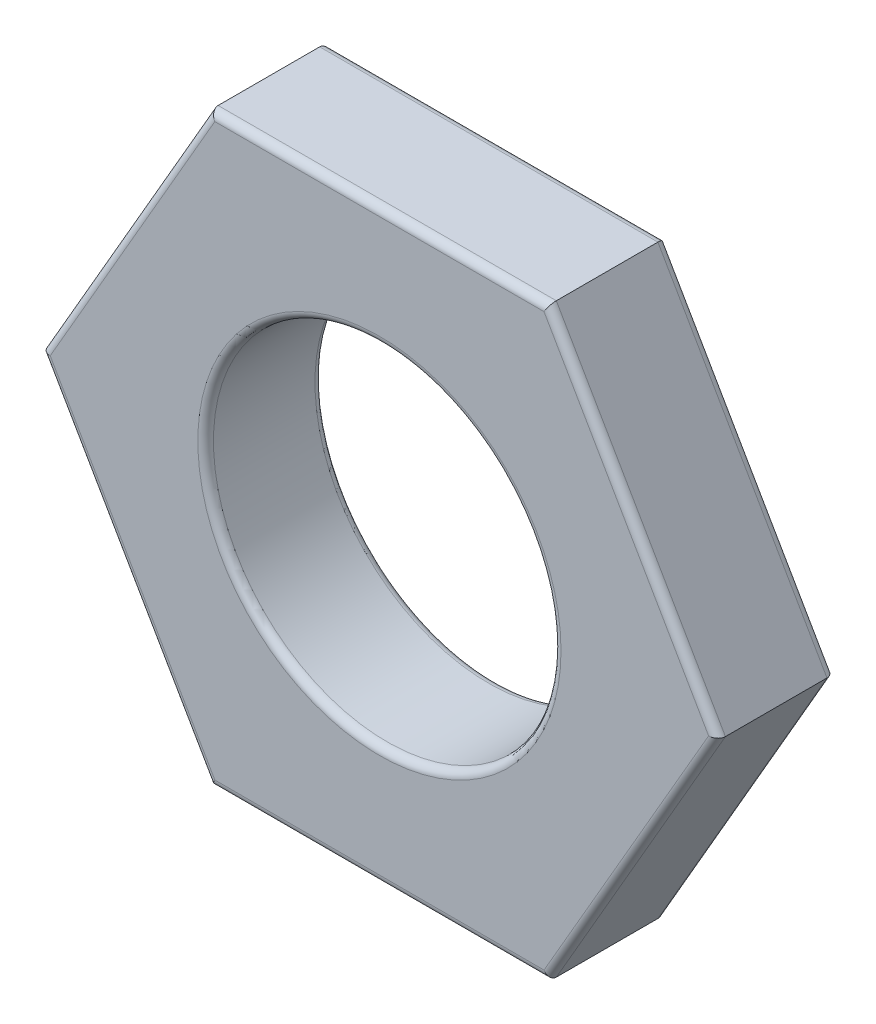
ISO-10303-21;
HEADER;
FILE_DESCRIPTION(('STEP AP214'),'2;1');
FILE_NAME('part.step','',(''),(''),'','','');
FILE_SCHEMA(('AUTOMOTIVE_DESIGN { 1 0 10303 214 1 1 1 1 }'));
ENDSEC;
DATA;
#1=APPLICATION_CONTEXT('core data for automotive mechanical design processes');
#2=APPLICATION_PROTOCOL_DEFINITION('international standard','automotive_design',2000,#1);
#3=PRODUCT_CONTEXT('',#1,'mechanical');
#4=PRODUCT('Part','Part','',(#3));
#5=PRODUCT_RELATED_PRODUCT_CATEGORY('part','',(#4));
#6=PRODUCT_DEFINITION_FORMATION('','',#4);
#7=PRODUCT_DEFINITION_CONTEXT('part definition',#1,'design');
#8=PRODUCT_DEFINITION('design','',#6,#7);
#9=PRODUCT_DEFINITION_SHAPE('','',#8);
#10=(LENGTH_UNIT() NAMED_UNIT(*) SI_UNIT(.MILLI.,.METRE.));
#11=(NAMED_UNIT(*) PLANE_ANGLE_UNIT() SI_UNIT($,.RADIAN.));
#12=(NAMED_UNIT(*) SI_UNIT($,.STERADIAN.) SOLID_ANGLE_UNIT());
#13=UNCERTAINTY_MEASURE_WITH_UNIT(LENGTH_MEASURE(1.E-05),#10,'distance_accuracy_value','');
#14=(GEOMETRIC_REPRESENTATION_CONTEXT(3) GLOBAL_UNCERTAINTY_ASSIGNED_CONTEXT((#13)) GLOBAL_UNIT_ASSIGNED_CONTEXT((#10,
#11,#12)) REPRESENTATION_CONTEXT('',''));
#15=CARTESIAN_POINT('',(0.,0.,0.));
#16=DIRECTION('',(0.,0.,1.));
#17=DIRECTION('',(1.,0.,0.));
#18=AXIS2_PLACEMENT_3D('',#15,#16,#17);
#19=CARTESIAN_POINT('',(-21.6506350946109,-37.5,15.));
#20=DIRECTION('',(0.,1.,0.));
#21=DIRECTION('',(0.,0.,1.));
#22=AXIS2_PLACEMENT_3D('',#19,#20,#21);
#23=PLANE('',#22);
#24=DIRECTION('',(0.,0.,-1.));
#25=VECTOR('',#24,1.);
#26=CARTESIAN_POINT('',(-21.6506350946109,-37.5,15.));
#27=LINE('',#26,#25);
#28=CARTESIAN_POINT('',(-21.6506350946109,-37.5,14.));
#29=VERTEX_POINT('',#28);
#30=CARTESIAN_POINT('',(-21.6506350946109,-37.5,1.));
#31=VERTEX_POINT('',#30);
#32=EDGE_CURVE('E175',#29,#31,#27,.T.);
#33=ORIENTED_EDGE('',*,*,#32,.T.);
#34=DIRECTION('',(1.,0.,0.));
#35=VECTOR('',#34,1.);
#36=CARTESIAN_POINT('',(-21.6506350946109,-37.5,1.));
#37=LINE('',#36,#35);
#38=CARTESIAN_POINT('',(21.650635094611,-37.5,1.));
#39=VERTEX_POINT('',#38);
#40=EDGE_CURVE('E208',#31,#39,#37,.T.);
#41=ORIENTED_EDGE('',*,*,#40,.T.);
#42=DIRECTION('',(0.,0.,-1.));
#43=VECTOR('',#42,1.);
#44=CARTESIAN_POINT('',(21.650635094611,-37.5,15.));
#45=LINE('',#44,#43);
#46=CARTESIAN_POINT('',(21.650635094611,-37.5,14.));
#47=VERTEX_POINT('',#46);
#48=EDGE_CURVE('E158',#47,#39,#45,.T.);
#49=ORIENTED_EDGE('',*,*,#48,.F.);
#50=DIRECTION('',(1.,0.,0.));
#51=VECTOR('',#50,1.);
#52=CARTESIAN_POINT('',(-21.6506350946109,-37.5,14.));
#53=LINE('',#52,#51);
#54=EDGE_CURVE('E210',#47,#29,#53,.F.);
#55=ORIENTED_EDGE('',*,*,#54,.T.);
#56=EDGE_LOOP('',(#33,#41,#49,#55));
#57=FACE_BOUND('',#56,.T.);
#58=ADVANCED_FACE('F32',(#57),#23,.F.);
#59=CARTESIAN_POINT('',(21.650635094611,-37.5,15.));
#60=DIRECTION('',(-0.866025403784439,0.5,0.));
#61=DIRECTION('',(-0.5,-0.866025403784439,0.));
#62=AXIS2_PLACEMENT_3D('',#59,#60,#61);
#63=PLANE('',#62);
#64=ORIENTED_EDGE('',*,*,#48,.T.);
#65=DIRECTION('',(0.5,0.866025403784439,0.));
#66=VECTOR('',#65,1.);
#67=CARTESIAN_POINT('',(21.650635094611,-37.5,1.));
#68=LINE('',#67,#66);
#69=CARTESIAN_POINT('',(43.3012701892219,0.,1.));
#70=VERTEX_POINT('',#69);
#71=EDGE_CURVE('E212',#39,#70,#68,.T.);
#72=ORIENTED_EDGE('',*,*,#71,.T.);
#73=DIRECTION('',(0.,0.,-1.));
#74=VECTOR('',#73,1.);
#75=CARTESIAN_POINT('',(43.3012701892219,0.,15.));
#76=LINE('',#75,#74);
#77=CARTESIAN_POINT('',(43.3012701892219,0.,14.));
#78=VERTEX_POINT('',#77);
#79=EDGE_CURVE('E239',#78,#70,#76,.T.);
#80=ORIENTED_EDGE('',*,*,#79,.F.);
#81=DIRECTION('',(0.5,0.866025403784439,0.));
#82=VECTOR('',#81,1.);
#83=CARTESIAN_POINT('',(21.650635094611,-37.5,14.));
#84=LINE('',#83,#82);
#85=EDGE_CURVE('E214',#78,#47,#84,.F.);
#86=ORIENTED_EDGE('',*,*,#85,.T.);
#87=EDGE_LOOP('',(#64,#72,#80,#86));
#88=FACE_BOUND('',#87,.T.);
#89=ADVANCED_FACE('F274',(#88),#63,.F.);
#90=CARTESIAN_POINT('',(43.3012701892219,0.,15.));
#91=DIRECTION('',(-0.866025403784439,-0.5,0.));
#92=DIRECTION('',(0.5,-0.866025403784439,0.));
#93=AXIS2_PLACEMENT_3D('',#90,#91,#92);
#94=PLANE('',#93);
#95=ORIENTED_EDGE('',*,*,#79,.T.);
#96=DIRECTION('',(-0.5,0.866025403784439,0.));
#97=VECTOR('',#96,1.);
#98=CARTESIAN_POINT('',(43.3012701892219,0.,1.));
#99=LINE('',#98,#97);
#100=CARTESIAN_POINT('',(21.650635094611,37.5,1.));
#101=VERTEX_POINT('',#100);
#102=EDGE_CURVE('E216',#70,#101,#99,.T.);
#103=ORIENTED_EDGE('',*,*,#102,.T.);
#104=DIRECTION('',(0.,0.,-1.));
#105=VECTOR('',#104,1.);
#106=CARTESIAN_POINT('',(21.650635094611,37.5,15.));
#107=LINE('',#106,#105);
#108=CARTESIAN_POINT('',(21.650635094611,37.5,14.));
#109=VERTEX_POINT('',#108);
#110=EDGE_CURVE('E148',#109,#101,#107,.T.);
#111=ORIENTED_EDGE('',*,*,#110,.F.);
#112=DIRECTION('',(-0.5,0.866025403784439,0.));
#113=VECTOR('',#112,1.);
#114=CARTESIAN_POINT('',(43.3012701892219,0.,14.));
#115=LINE('',#114,#113);
#116=EDGE_CURVE('E218',#109,#78,#115,.F.);
#117=ORIENTED_EDGE('',*,*,#116,.T.);
#118=EDGE_LOOP('',(#95,#103,#111,#117));
#119=FACE_BOUND('',#118,.T.);
#120=ADVANCED_FACE('F277',(#119),#94,.F.);
#121=CARTESIAN_POINT('',(21.650635094611,37.5,15.));
#122=DIRECTION('',(0.,-1.,0.));
#123=DIRECTION('',(1.,0.,0.));
#124=AXIS2_PLACEMENT_3D('',#121,#122,#123);
#125=PLANE('',#124);
#126=ORIENTED_EDGE('',*,*,#110,.T.);
#127=DIRECTION('',(-1.,0.,0.));
#128=VECTOR('',#127,1.);
#129=CARTESIAN_POINT('',(21.650635094611,37.5,1.));
#130=LINE('',#129,#128);
#131=CARTESIAN_POINT('',(-21.650635094611,37.5,1.));
#132=VERTEX_POINT('',#131);
#133=EDGE_CURVE('E147',#101,#132,#130,.T.);
#134=ORIENTED_EDGE('',*,*,#133,.T.);
#135=DIRECTION('',(0.,0.,-1.));
#136=VECTOR('',#135,1.);
#137=CARTESIAN_POINT('',(-21.650635094611,37.5,15.));
#138=LINE('',#137,#136);
#139=CARTESIAN_POINT('',(-21.650635094611,37.5,14.));
#140=VERTEX_POINT('',#139);
#141=EDGE_CURVE('E129',#140,#132,#138,.T.);
#142=ORIENTED_EDGE('',*,*,#141,.F.);
#143=DIRECTION('',(-1.,0.,0.));
#144=VECTOR('',#143,1.);
#145=CARTESIAN_POINT('',(21.650635094611,37.5,14.));
#146=LINE('',#145,#144);
#147=EDGE_CURVE('E144',#140,#109,#146,.F.);
#148=ORIENTED_EDGE('',*,*,#147,.T.);
#149=EDGE_LOOP('',(#126,#134,#142,#148));
#150=FACE_BOUND('',#149,.T.);
#151=ADVANCED_FACE('F143',(#150),#125,.F.);
#152=CARTESIAN_POINT('',(-21.650635094611,37.5,15.));
#153=DIRECTION('',(0.866025403784438,-0.5,0.));
#154=DIRECTION('',(0.5,0.866025403784439,0.));
#155=AXIS2_PLACEMENT_3D('',#152,#153,#154);
#156=PLANE('',#155);
#157=ORIENTED_EDGE('',*,*,#141,.T.);
#158=DIRECTION('',(-0.5,-0.866025403784439,0.));
#159=VECTOR('',#158,1.);
#160=CARTESIAN_POINT('',(-21.650635094611,37.5,1.));
#161=LINE('',#160,#159);
#162=CARTESIAN_POINT('',(-43.3012701892219,0.,1.));
#163=VERTEX_POINT('',#162);
#164=EDGE_CURVE('E136',#132,#163,#161,.T.);
#165=ORIENTED_EDGE('',*,*,#164,.T.);
#166=DIRECTION('',(0.,0.,-1.));
#167=VECTOR('',#166,1.);
#168=CARTESIAN_POINT('',(-43.3012701892219,0.,15.));
#169=LINE('',#168,#167);
#170=CARTESIAN_POINT('',(-43.3012701892219,0.,14.));
#171=VERTEX_POINT('',#170);
#172=EDGE_CURVE('E131',#171,#163,#169,.T.);
#173=ORIENTED_EDGE('',*,*,#172,.F.);
#174=DIRECTION('',(-0.5,-0.866025403784439,0.));
#175=VECTOR('',#174,1.);
#176=CARTESIAN_POINT('',(-21.650635094611,37.5,14.));
#177=LINE('',#176,#175);
#178=EDGE_CURVE('E126',#171,#140,#177,.F.);
#179=ORIENTED_EDGE('',*,*,#178,.T.);
#180=EDGE_LOOP('',(#157,#165,#173,#179));
#181=FACE_BOUND('',#180,.T.);
#182=ADVANCED_FACE('F128',(#181),#156,.F.);
#183=CARTESIAN_POINT('',(-43.3012701892219,0.,15.));
#184=DIRECTION('',(0.866025403784439,0.5,0.));
#185=DIRECTION('',(-0.5,0.866025403784439,0.));
#186=AXIS2_PLACEMENT_3D('',#183,#184,#185);
#187=PLANE('',#186);
#188=ORIENTED_EDGE('',*,*,#172,.T.);
#189=DIRECTION('',(0.5,-0.866025403784439,0.));
#190=VECTOR('',#189,1.);
#191=CARTESIAN_POINT('',(-43.3012701892219,0.,1.));
#192=LINE('',#191,#190);
#193=EDGE_CURVE('E137',#163,#31,#192,.T.);
#194=ORIENTED_EDGE('',*,*,#193,.T.);
#195=ORIENTED_EDGE('',*,*,#32,.F.);
#196=DIRECTION('',(0.5,-0.866025403784439,0.));
#197=VECTOR('',#196,1.);
#198=CARTESIAN_POINT('',(-43.3012701892219,0.,14.));
#199=LINE('',#198,#197);
#200=EDGE_CURVE('E206',#29,#171,#199,.F.);
#201=ORIENTED_EDGE('',*,*,#200,.T.);
#202=EDGE_LOOP('',(#188,#194,#195,#201));
#203=FACE_BOUND('',#202,.T.);
#204=ADVANCED_FACE('F289',(#203),#187,.F.);
#205=CARTESIAN_POINT('',(21.650635094611,-37.5,15.));
#206=DIRECTION('',(0.,0.,1.));
#207=DIRECTION('',(1.,0.,0.));
#208=AXIS2_PLACEMENT_3D('',#205,#206,#207);
#209=PLANE('',#208);
#210=CARTESIAN_POINT('',(0.,0.,15.));
#211=DIRECTION('',(0.,0.,1.));
#212=DIRECTION('',(1.,0.,0.));
#213=AXIS2_PLACEMENT_3D('',#210,#211,#212);
#214=CIRCLE('',#213,23.25);
#215=CARTESIAN_POINT('',(23.25,0.,15.));
#216=VERTEX_POINT('',#215);
#217=EDGE_CURVE('E11',#216,#216,#214,.F.);
#218=ORIENTED_EDGE('',*,*,#217,.T.);
#219=EDGE_LOOP('',(#218));
#220=FACE_BOUND('',#219,.T.);
#221=DIRECTION('',(-0.5,-0.866025403784439,0.));
#222=VECTOR('',#221,1.);
#223=CARTESIAN_POINT('',(-42.4352447854375,-0.499999999999984,15.));
#224=LINE('',#223,#222);
#225=CARTESIAN_POINT('',(-21.0732848254213,36.5,15.));
#226=VERTEX_POINT('',#225);
#227=CARTESIAN_POINT('',(-42.1465696508427,0.,15.));
#228=VERTEX_POINT('',#227);
#229=EDGE_CURVE('E161',#226,#228,#224,.T.);
#230=ORIENTED_EDGE('',*,*,#229,.T.);
#231=DIRECTION('',(0.5,-0.866025403784439,0.));
#232=VECTOR('',#231,1.);
#233=CARTESIAN_POINT('',(-20.7846096908265,-37.,15.));
#234=LINE('',#233,#232);
#235=CARTESIAN_POINT('',(-21.0732848254213,-36.5,15.));
#236=VERTEX_POINT('',#235);
#237=EDGE_CURVE('E41',#228,#236,#234,.T.);
#238=ORIENTED_EDGE('',*,*,#237,.T.);
#239=DIRECTION('',(1.,0.,0.));
#240=VECTOR('',#239,1.);
#241=CARTESIAN_POINT('',(21.650635094611,-36.5,15.));
#242=LINE('',#241,#240);
#243=CARTESIAN_POINT('',(21.0732848254214,-36.5,15.));
#244=VERTEX_POINT('',#243);
#245=EDGE_CURVE('E56',#236,#244,#242,.T.);
#246=ORIENTED_EDGE('',*,*,#245,.T.);
#247=DIRECTION('',(0.5,0.866025403784439,0.));
#248=VECTOR('',#247,1.);
#249=CARTESIAN_POINT('',(42.4352447854375,0.5,15.));
#250=LINE('',#249,#248);
#251=CARTESIAN_POINT('',(42.1465696508427,0.,15.));
#252=VERTEX_POINT('',#251);
#253=EDGE_CURVE('E191',#244,#252,#250,.T.);
#254=ORIENTED_EDGE('',*,*,#253,.T.);
#255=DIRECTION('',(-0.5,0.866025403784439,0.));
#256=VECTOR('',#255,1.);
#257=CARTESIAN_POINT('',(20.7846096908266,37.,15.));
#258=LINE('',#257,#256);
#259=CARTESIAN_POINT('',(21.0732848254214,36.5,15.));
#260=VERTEX_POINT('',#259);
#261=EDGE_CURVE('E193',#252,#260,#258,.T.);
#262=ORIENTED_EDGE('',*,*,#261,.T.);
#263=DIRECTION('',(-1.,0.,0.));
#264=VECTOR('',#263,1.);
#265=CARTESIAN_POINT('',(-21.650635094611,36.5,15.));
#266=LINE('',#265,#264);
#267=EDGE_CURVE('E195',#260,#226,#266,.T.);
#268=ORIENTED_EDGE('',*,*,#267,.T.);
#269=EDGE_LOOP('',(#230,#238,#246,#254,#262,#268));
#270=FACE_BOUND('',#269,.T.);
#271=ADVANCED_FACE('F287',(#220,#270),#209,.T.);
#272=CARTESIAN_POINT('',(21.650635094611,-37.5,0.));
#273=DIRECTION('',(0.,0.,1.));
#274=DIRECTION('',(1.,0.,0.));
#275=AXIS2_PLACEMENT_3D('',#272,#273,#274);
#276=PLANE('',#275);
#277=DIRECTION('',(-0.5,-0.866025403784439,0.));
#278=VECTOR('',#277,1.);
#279=CARTESIAN_POINT('',(-42.4352447854375,-0.499999999999994,0.));
#280=LINE('',#279,#278);
#281=CARTESIAN_POINT('',(-42.1465696508427,0.,0.));
#282=VERTEX_POINT('',#281);
#283=CARTESIAN_POINT('',(-21.0732848254213,36.5,0.));
#284=VERTEX_POINT('',#283);
#285=EDGE_CURVE('E231',#282,#284,#280,.F.);
#286=ORIENTED_EDGE('',*,*,#285,.T.);
#287=DIRECTION('',(-1.,0.,0.));
#288=VECTOR('',#287,1.);
#289=CARTESIAN_POINT('',(21.650635094611,36.5,0.));
#290=LINE('',#289,#288);
#291=CARTESIAN_POINT('',(21.0732848254214,36.5,0.));
#292=VERTEX_POINT('',#291);
#293=EDGE_CURVE('E220',#284,#292,#290,.F.);
#294=ORIENTED_EDGE('',*,*,#293,.T.);
#295=DIRECTION('',(-0.5,0.866025403784439,0.));
#296=VECTOR('',#295,1.);
#297=CARTESIAN_POINT('',(53.260562332743,-19.25,0.));
#298=LINE('',#297,#296);
#299=CARTESIAN_POINT('',(42.1465696508427,0.,0.));
#300=VERTEX_POINT('',#299);
#301=EDGE_CURVE('E223',#292,#300,#298,.F.);
#302=ORIENTED_EDGE('',*,*,#301,.T.);
#303=DIRECTION('',(0.5,0.866025403784439,0.));
#304=VECTOR('',#303,1.);
#305=CARTESIAN_POINT('',(20.7846096908265,-37.,0.));
#306=LINE('',#305,#304);
#307=CARTESIAN_POINT('',(21.0732848254214,-36.5,0.));
#308=VERTEX_POINT('',#307);
#309=EDGE_CURVE('E225',#300,#308,#306,.F.);
#310=ORIENTED_EDGE('',*,*,#309,.T.);
#311=DIRECTION('',(1.,0.,0.));
#312=VECTOR('',#311,1.);
#313=CARTESIAN_POINT('',(21.650635094611,-36.5,0.));
#314=LINE('',#313,#312);
#315=CARTESIAN_POINT('',(-21.0732848254213,-36.5,0.));
#316=VERTEX_POINT('',#315);
#317=EDGE_CURVE('E227',#308,#316,#314,.F.);
#318=ORIENTED_EDGE('',*,*,#317,.T.);
#319=DIRECTION('',(0.5,-0.866025403784439,0.));
#320=VECTOR('',#319,1.);
#321=CARTESIAN_POINT('',(-9.95929214352103,-55.75,0.));
#322=LINE('',#321,#320);
#323=EDGE_CURVE('E229',#316,#282,#322,.F.);
#324=ORIENTED_EDGE('',*,*,#323,.T.);
#325=EDGE_LOOP('',(#286,#294,#302,#310,#318,#324));
#326=FACE_BOUND('',#325,.T.);
#327=CARTESIAN_POINT('',(0.,0.,0.));
#328=DIRECTION('',(0.,0.,1.));
#329=DIRECTION('',(1.,0.,0.));
#330=AXIS2_PLACEMENT_3D('',#327,#328,#329);
#331=CIRCLE('',#330,23.25);
#332=CARTESIAN_POINT('',(23.25,0.,0.));
#333=VERTEX_POINT('',#332);
#334=EDGE_CURVE('E233',#333,#333,#331,.T.);
#335=ORIENTED_EDGE('',*,*,#334,.T.);
#336=EDGE_LOOP('',(#335));
#337=FACE_BOUND('',#336,.T.);
#338=ADVANCED_FACE('F264',(#326,#337),#276,.F.);
#339=CARTESIAN_POINT('',(0.,0.,0.));
#340=DIRECTION('',(0.,0.,1.));
#341=DIRECTION('',(1.,0.,0.));
#342=AXIS2_PLACEMENT_3D('',#339,#340,#341);
#343=CYLINDRICAL_SURFACE('',#342,22.25);
#344=CARTESIAN_POINT('',(0.,0.,1.));
#345=DIRECTION('',(0.,0.,1.));
#346=DIRECTION('',(1.,0.,0.));
#347=AXIS2_PLACEMENT_3D('',#344,#345,#346);
#348=CIRCLE('',#347,22.25);
#349=CARTESIAN_POINT('',(22.25,0.,1.));
#350=VERTEX_POINT('',#349);
#351=EDGE_CURVE('E198',#350,#350,#348,.F.);
#352=ORIENTED_EDGE('',*,*,#351,.T.);
#353=EDGE_LOOP('',(#352));
#354=FACE_BOUND('',#353,.T.);
#355=CARTESIAN_POINT('',(0.,0.,14.));
#356=DIRECTION('',(0.,0.,1.));
#357=DIRECTION('',(1.,0.,0.));
#358=AXIS2_PLACEMENT_3D('',#355,#356,#357);
#359=CIRCLE('',#358,22.25);
#360=CARTESIAN_POINT('',(22.25,0.,14.));
#361=VERTEX_POINT('',#360);
#362=EDGE_CURVE('E201',#361,#361,#359,.T.);
#363=ORIENTED_EDGE('',*,*,#362,.T.);
#364=EDGE_LOOP('',(#363));
#365=FACE_BOUND('',#364,.T.);
#366=ADVANCED_FACE('F327',(#354,#365),#343,.F.);
#367=CARTESIAN_POINT('',(-21.6506350946109,-36.5,1.));
#368=DIRECTION('',(1.,0.,0.));
#369=DIRECTION('',(0.,0.,-1.));
#370=AXIS2_PLACEMENT_3D('',#367,#368,#369);
#371=CYLINDRICAL_SURFACE('',#370,1.);
#372=CARTESIAN_POINT('',(-21.0732848254213,-36.5,1.));
#373=DIRECTION('',(0.866025403784439,-0.5,0.));
#374=DIRECTION('',(-0.5,-0.866025403784439,0.));
#375=AXIS2_PLACEMENT_3D('',#372,#373,#374);
#376=ELLIPSE('',#375,1.15470053837925,1.);
#377=EDGE_CURVE('E176',#316,#31,#376,.F.);
#378=ORIENTED_EDGE('',*,*,#377,.F.);
#379=ORIENTED_EDGE('',*,*,#317,.F.);
#380=CARTESIAN_POINT('',(21.0732848254214,-36.5,1.));
#381=DIRECTION('',(0.866025403784438,0.5,0.));
#382=DIRECTION('',(0.5,-0.866025403784439,0.));
#383=AXIS2_PLACEMENT_3D('',#380,#381,#382);
#384=ELLIPSE('',#383,1.15470053837925,1.);
#385=EDGE_CURVE('E172',#39,#308,#384,.T.);
#386=ORIENTED_EDGE('',*,*,#385,.F.);
#387=ORIENTED_EDGE('',*,*,#40,.F.);
#388=EDGE_LOOP('',(#378,#379,#386,#387));
#389=FACE_BOUND('',#388,.T.);
#390=ADVANCED_FACE('F254',(#389),#371,.T.);
#391=CARTESIAN_POINT('',(20.7846096908265,-37.,1.));
#392=DIRECTION('',(0.5,0.866025403784439,0.));
#393=DIRECTION('',(-0.866025403784439,0.5,0.));
#394=AXIS2_PLACEMENT_3D('',#391,#392,#393);
#395=CYLINDRICAL_SURFACE('',#394,1.);
#396=ORIENTED_EDGE('',*,*,#385,.T.);
#397=ORIENTED_EDGE('',*,*,#309,.F.);
#398=CARTESIAN_POINT('',(42.1465696508427,0.,1.));
#399=DIRECTION('',(0.,1.,0.));
#400=DIRECTION('',(1.,0.,0.));
#401=AXIS2_PLACEMENT_3D('',#398,#399,#400);
#402=ELLIPSE('',#401,1.15470053837925,1.);
#403=EDGE_CURVE('E179',#70,#300,#402,.T.);
#404=ORIENTED_EDGE('',*,*,#403,.F.);
#405=ORIENTED_EDGE('',*,*,#71,.F.);
#406=EDGE_LOOP('',(#396,#397,#404,#405));
#407=FACE_BOUND('',#406,.T.);
#408=ADVANCED_FACE('F269',(#407),#395,.T.);
#409=CARTESIAN_POINT('',(-42.4352447854375,0.500000000000014,1.));
#410=DIRECTION('',(0.5,-0.866025403784439,0.));
#411=DIRECTION('',(0.866025403784439,0.5,0.));
#412=AXIS2_PLACEMENT_3D('',#409,#410,#411);
#413=CYLINDRICAL_SURFACE('',#412,1.);
#414=ORIENTED_EDGE('',*,*,#377,.T.);
#415=ORIENTED_EDGE('',*,*,#193,.F.);
#416=CARTESIAN_POINT('',(-42.1465696508427,0.,1.));
#417=DIRECTION('',(0.,-1.,0.));
#418=DIRECTION('',(-1.,0.,0.));
#419=AXIS2_PLACEMENT_3D('',#416,#417,#418);
#420=ELLIPSE('',#419,1.15470053837925,1.);
#421=EDGE_CURVE('E182',#282,#163,#420,.F.);
#422=ORIENTED_EDGE('',*,*,#421,.F.);
#423=ORIENTED_EDGE('',*,*,#323,.F.);
#424=EDGE_LOOP('',(#414,#415,#422,#423));
#425=FACE_BOUND('',#424,.T.);
#426=ADVANCED_FACE('F260',(#425),#413,.T.);
#427=CARTESIAN_POINT('',(42.4352447854375,-0.500000000000001,1.));
#428=DIRECTION('',(-0.5,0.866025403784439,0.));
#429=DIRECTION('',(-0.866025403784439,-0.5,0.));
#430=AXIS2_PLACEMENT_3D('',#427,#428,#429);
#431=CYLINDRICAL_SURFACE('',#430,1.);
#432=ORIENTED_EDGE('',*,*,#403,.T.);
#433=ORIENTED_EDGE('',*,*,#301,.F.);
#434=CARTESIAN_POINT('',(21.0732848254214,36.5,1.));
#435=DIRECTION('',(-0.866025403784439,0.5,0.));
#436=DIRECTION('',(0.5,0.866025403784439,0.));
#437=AXIS2_PLACEMENT_3D('',#434,#435,#436);
#438=ELLIPSE('',#437,1.15470053837925,1.);
#439=EDGE_CURVE('E185',#101,#292,#438,.T.);
#440=ORIENTED_EDGE('',*,*,#439,.F.);
#441=ORIENTED_EDGE('',*,*,#102,.F.);
#442=EDGE_LOOP('',(#432,#433,#440,#441));
#443=FACE_BOUND('',#442,.T.);
#444=ADVANCED_FACE('F316',(#443),#431,.T.);
#445=CARTESIAN_POINT('',(-20.7846096908265,37.,1.));
#446=DIRECTION('',(-0.5,-0.866025403784439,0.));
#447=DIRECTION('',(0.866025403784438,-0.5,0.));
#448=AXIS2_PLACEMENT_3D('',#445,#446,#447);
#449=CYLINDRICAL_SURFACE('',#448,1.);
#450=ORIENTED_EDGE('',*,*,#421,.T.);
#451=ORIENTED_EDGE('',*,*,#164,.F.);
#452=CARTESIAN_POINT('',(-21.0732848254213,36.5,1.));
#453=DIRECTION('',(-0.866025403784439,-0.5,0.));
#454=DIRECTION('',(0.5,-0.866025403784439,0.));
#455=AXIS2_PLACEMENT_3D('',#452,#453,#454);
#456=ELLIPSE('',#455,1.15470053837925,1.);
#457=EDGE_CURVE('E187',#284,#132,#456,.F.);
#458=ORIENTED_EDGE('',*,*,#457,.F.);
#459=ORIENTED_EDGE('',*,*,#285,.F.);
#460=EDGE_LOOP('',(#450,#451,#458,#459));
#461=FACE_BOUND('',#460,.T.);
#462=ADVANCED_FACE('F312',(#461),#449,.T.);
#463=CARTESIAN_POINT('',(21.650635094611,36.5,1.));
#464=DIRECTION('',(-1.,0.,0.));
#465=DIRECTION('',(0.,-1.,0.));
#466=AXIS2_PLACEMENT_3D('',#463,#464,#465);
#467=CYLINDRICAL_SURFACE('',#466,1.);
#468=ORIENTED_EDGE('',*,*,#439,.T.);
#469=ORIENTED_EDGE('',*,*,#293,.F.);
#470=ORIENTED_EDGE('',*,*,#457,.T.);
#471=ORIENTED_EDGE('',*,*,#133,.F.);
#472=EDGE_LOOP('',(#468,#469,#470,#471));
#473=FACE_BOUND('',#472,.T.);
#474=ADVANCED_FACE('F308',(#473),#467,.T.);
#475=CARTESIAN_POINT('',(0.,0.,1.));
#476=DIRECTION('',(0.,0.,1.));
#477=DIRECTION('',(1.,0.,0.));
#478=AXIS2_PLACEMENT_3D('',#475,#476,#477);
#479=TOROIDAL_SURFACE('',#478,23.25,1.);
#480=ORIENTED_EDGE('',*,*,#351,.F.);
#481=EDGE_LOOP('',(#480));
#482=FACE_BOUND('',#481,.T.);
#483=ORIENTED_EDGE('',*,*,#334,.F.);
#484=EDGE_LOOP('',(#483));
#485=FACE_BOUND('',#484,.T.);
#486=ADVANCED_FACE('F311',(#482,#485),#479,.T.);
#487=CARTESIAN_POINT('',(0.,0.,14.));
#488=DIRECTION('',(0.,0.,1.));
#489=DIRECTION('',(1.,0.,0.));
#490=AXIS2_PLACEMENT_3D('',#487,#488,#489);
#491=TOROIDAL_SURFACE('',#490,23.25,1.);
#492=ORIENTED_EDGE('',*,*,#217,.F.);
#493=EDGE_LOOP('',(#492));
#494=FACE_BOUND('',#493,.T.);
#495=ORIENTED_EDGE('',*,*,#362,.F.);
#496=EDGE_LOOP('',(#495));
#497=FACE_BOUND('',#496,.T.);
#498=ADVANCED_FACE('F330',(#494,#497),#491,.T.);
#499=CARTESIAN_POINT('',(53.260562332743,-19.25,14.));
#500=DIRECTION('',(0.5,-0.866025403784439,0.));
#501=DIRECTION('',(0.866025403784439,0.5,0.));
#502=AXIS2_PLACEMENT_3D('',#499,#500,#501);
#503=CYLINDRICAL_SURFACE('',#502,1.);
#504=CARTESIAN_POINT('',(42.1465696508427,0.,14.));
#505=DIRECTION('',(0.,-1.,0.));
#506=DIRECTION('',(1.,0.,0.));
#507=AXIS2_PLACEMENT_3D('',#504,#505,#506);
#508=ELLIPSE('',#507,1.15470053837925,1.);
#509=EDGE_CURVE('E162',#78,#252,#508,.T.);
#510=ORIENTED_EDGE('',*,*,#509,.F.);
#511=ORIENTED_EDGE('',*,*,#116,.F.);
#512=CARTESIAN_POINT('',(21.0732848254214,36.5,14.));
#513=DIRECTION('',(0.866025403784439,-0.5,0.));
#514=DIRECTION('',(0.5,0.866025403784439,0.));
#515=AXIS2_PLACEMENT_3D('',#512,#513,#514);
#516=ELLIPSE('',#515,1.15470053837925,1.);
#517=EDGE_CURVE('E36',#260,#109,#516,.F.);
#518=ORIENTED_EDGE('',*,*,#517,.F.);
#519=ORIENTED_EDGE('',*,*,#261,.F.);
#520=EDGE_LOOP('',(#510,#511,#518,#519));
#521=FACE_BOUND('',#520,.T.);
#522=ADVANCED_FACE('F34',(#521),#503,.T.);
#523=CARTESIAN_POINT('',(21.650635094611,36.5,14.));
#524=DIRECTION('',(1.,0.,0.));
#525=DIRECTION('',(0.,1.,0.));
#526=AXIS2_PLACEMENT_3D('',#523,#524,#525);
#527=CYLINDRICAL_SURFACE('',#526,1.);
#528=ORIENTED_EDGE('',*,*,#517,.T.);
#529=ORIENTED_EDGE('',*,*,#147,.F.);
#530=CARTESIAN_POINT('',(-21.0732848254213,36.5,14.));
#531=DIRECTION('',(0.866025403784439,0.5,0.));
#532=DIRECTION('',(-0.5,0.866025403784439,0.));
#533=AXIS2_PLACEMENT_3D('',#530,#531,#532);
#534=ELLIPSE('',#533,1.15470053837925,1.);
#535=EDGE_CURVE('E155',#226,#140,#534,.F.);
#536=ORIENTED_EDGE('',*,*,#535,.F.);
#537=ORIENTED_EDGE('',*,*,#267,.F.);
#538=EDGE_LOOP('',(#528,#529,#536,#537));
#539=FACE_BOUND('',#538,.T.);
#540=ADVANCED_FACE('F153',(#539),#527,.T.);
#541=CARTESIAN_POINT('',(20.7846096908265,-37.,14.));
#542=DIRECTION('',(-0.5,-0.866025403784439,0.));
#543=DIRECTION('',(0.866025403784439,-0.5,0.));
#544=AXIS2_PLACEMENT_3D('',#541,#542,#543);
#545=CYLINDRICAL_SURFACE('',#544,1.);
#546=ORIENTED_EDGE('',*,*,#509,.T.);
#547=ORIENTED_EDGE('',*,*,#253,.F.);
#548=CARTESIAN_POINT('',(21.0732848254214,-36.5,14.));
#549=DIRECTION('',(-0.866025403784438,-0.5,0.));
#550=DIRECTION('',(0.5,-0.866025403784439,0.));
#551=AXIS2_PLACEMENT_3D('',#548,#549,#550);
#552=ELLIPSE('',#551,1.15470053837925,1.);
#553=EDGE_CURVE('E163',#47,#244,#552,.T.);
#554=ORIENTED_EDGE('',*,*,#553,.F.);
#555=ORIENTED_EDGE('',*,*,#85,.F.);
#556=EDGE_LOOP('',(#546,#547,#554,#555));
#557=FACE_BOUND('',#556,.T.);
#558=ADVANCED_FACE('F284',(#557),#545,.T.);
#559=CARTESIAN_POINT('',(-42.4352447854375,-0.499999999999994,14.));
#560=DIRECTION('',(0.5,0.866025403784439,0.));
#561=DIRECTION('',(-0.866025403784438,0.5,0.));
#562=AXIS2_PLACEMENT_3D('',#559,#560,#561);
#563=CYLINDRICAL_SURFACE('',#562,1.);
#564=ORIENTED_EDGE('',*,*,#535,.T.);
#565=ORIENTED_EDGE('',*,*,#178,.F.);
#566=CARTESIAN_POINT('',(-42.1465696508427,0.,14.));
#567=DIRECTION('',(0.,1.,0.));
#568=DIRECTION('',(1.,0.,0.));
#569=AXIS2_PLACEMENT_3D('',#566,#567,#568);
#570=ELLIPSE('',#569,1.15470053837925,1.);
#571=EDGE_CURVE('E167',#228,#171,#570,.F.);
#572=ORIENTED_EDGE('',*,*,#571,.F.);
#573=ORIENTED_EDGE('',*,*,#229,.F.);
#574=EDGE_LOOP('',(#564,#565,#572,#573));
#575=FACE_BOUND('',#574,.T.);
#576=ADVANCED_FACE('F160',(#575),#563,.T.);
#577=CARTESIAN_POINT('',(21.650635094611,-36.5,14.));
#578=DIRECTION('',(-1.,0.,0.));
#579=DIRECTION('',(0.,0.,1.));
#580=AXIS2_PLACEMENT_3D('',#577,#578,#579);
#581=CYLINDRICAL_SURFACE('',#580,1.);
#582=ORIENTED_EDGE('',*,*,#553,.T.);
#583=ORIENTED_EDGE('',*,*,#245,.F.);
#584=CARTESIAN_POINT('',(-21.0732848254213,-36.5,14.));
#585=DIRECTION('',(-0.866025403784439,0.5,0.));
#586=DIRECTION('',(-0.5,-0.866025403784439,0.));
#587=AXIS2_PLACEMENT_3D('',#584,#585,#586);
#588=ELLIPSE('',#587,1.15470053837925,1.);
#589=EDGE_CURVE('E49',#29,#236,#588,.T.);
#590=ORIENTED_EDGE('',*,*,#589,.F.);
#591=ORIENTED_EDGE('',*,*,#54,.F.);
#592=EDGE_LOOP('',(#582,#583,#590,#591));
#593=FACE_BOUND('',#592,.T.);
#594=ADVANCED_FACE('F286',(#593),#581,.T.);
#595=CARTESIAN_POINT('',(-9.95929214352103,-55.75,14.));
#596=DIRECTION('',(-0.5,0.866025403784439,0.));
#597=DIRECTION('',(-0.866025403784439,-0.5,0.));
#598=AXIS2_PLACEMENT_3D('',#595,#596,#597);
#599=CYLINDRICAL_SURFACE('',#598,1.);
#600=ORIENTED_EDGE('',*,*,#571,.T.);
#601=ORIENTED_EDGE('',*,*,#200,.F.);
#602=ORIENTED_EDGE('',*,*,#589,.T.);
#603=ORIENTED_EDGE('',*,*,#237,.F.);
#604=EDGE_LOOP('',(#600,#601,#602,#603));
#605=FACE_BOUND('',#604,.T.);
#606=ADVANCED_FACE('F288',(#605),#599,.T.);
#607=CLOSED_SHELL('',(#58,#89,#120,#151,#182,#204,#271,#338,#366,#390,#408,#426,#444,#462,#474,
#486,#498,#522,#540,#558,#576,#594,#606));
#608=MANIFOLD_SOLID_BREP('B2',#607);
#609=ADVANCED_BREP_SHAPE_REPRESENTATION('',(#18,#608),#14);
#610=SHAPE_DEFINITION_REPRESENTATION(#9,#609);
ENDSEC;
END-ISO-10303-21;
